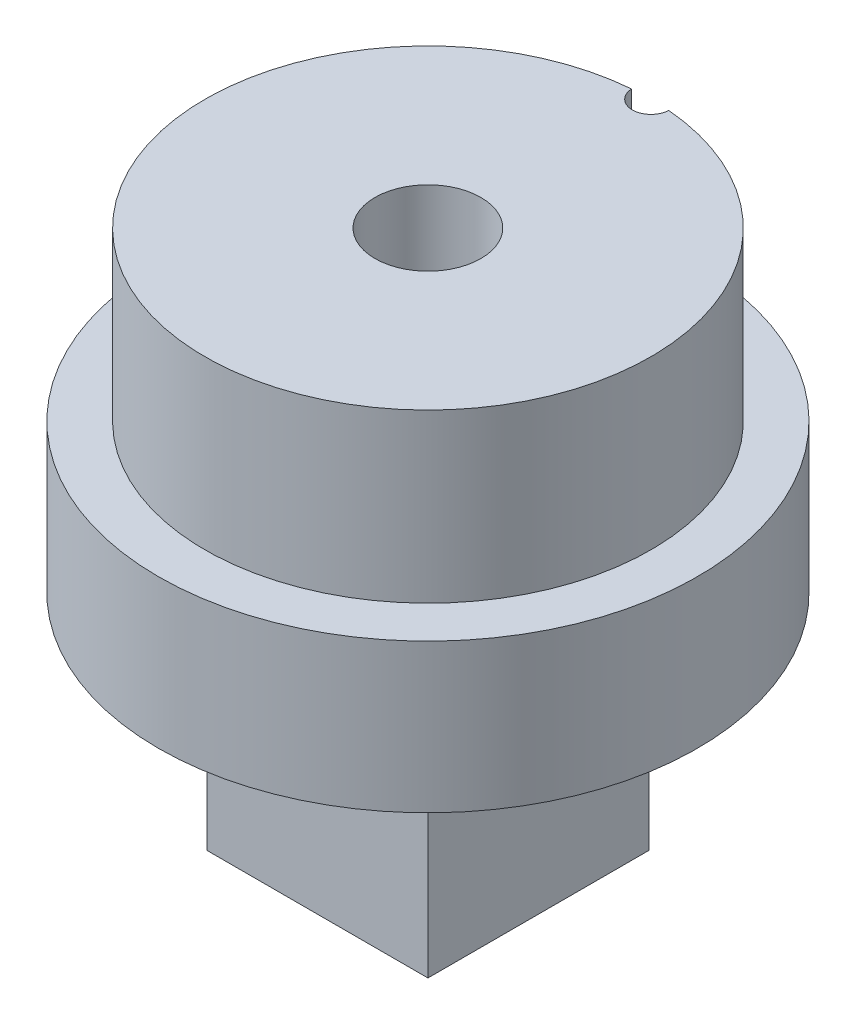
ISO-10303-21;
HEADER;
FILE_DESCRIPTION(('STEP AP214'),'2;1');
FILE_NAME('part.step','',(''),(''),'','','');
FILE_SCHEMA(('AUTOMOTIVE_DESIGN { 1 0 10303 214 1 1 1 1 }'));
ENDSEC;
DATA;
#1=APPLICATION_CONTEXT('core data for automotive mechanical design processes');
#2=APPLICATION_PROTOCOL_DEFINITION('international standard','automotive_design',2000,#1);
#3=PRODUCT_CONTEXT('',#1,'mechanical');
#4=PRODUCT('Part','Part','',(#3));
#5=PRODUCT_RELATED_PRODUCT_CATEGORY('part','',(#4));
#6=PRODUCT_DEFINITION_FORMATION('','',#4);
#7=PRODUCT_DEFINITION_CONTEXT('part definition',#1,'design');
#8=PRODUCT_DEFINITION('design','',#6,#7);
#9=PRODUCT_DEFINITION_SHAPE('','',#8);
#10=(LENGTH_UNIT() NAMED_UNIT(*) SI_UNIT(.MILLI.,.METRE.));
#11=(NAMED_UNIT(*) PLANE_ANGLE_UNIT() SI_UNIT($,.RADIAN.));
#12=(NAMED_UNIT(*) SI_UNIT($,.STERADIAN.) SOLID_ANGLE_UNIT());
#13=UNCERTAINTY_MEASURE_WITH_UNIT(LENGTH_MEASURE(1.E-05),#10,'distance_accuracy_value','');
#14=(GEOMETRIC_REPRESENTATION_CONTEXT(3) GLOBAL_UNCERTAINTY_ASSIGNED_CONTEXT((#13)) GLOBAL_UNIT_ASSIGNED_CONTEXT((#10,
#11,#12)) REPRESENTATION_CONTEXT('',''));
#15=CARTESIAN_POINT('',(0.,0.,0.));
#16=DIRECTION('',(0.,0.,1.));
#17=DIRECTION('',(1.,0.,0.));
#18=AXIS2_PLACEMENT_3D('',#15,#16,#17);
#19=CARTESIAN_POINT('',(0.,10.,0.));
#20=DIRECTION('',(0.,1.,0.));
#21=DIRECTION('',(0.,0.,1.));
#22=AXIS2_PLACEMENT_3D('',#19,#20,#21);
#23=PLANE('',#22);
#24=CARTESIAN_POINT('',(0.,10.,0.));
#25=DIRECTION('',(0.,1.,0.));
#26=DIRECTION('',(0.,0.,1.));
#27=AXIS2_PLACEMENT_3D('',#24,#25,#26);
#28=CIRCLE('',#27,7.25);
#29=CARTESIAN_POINT('',(0.,10.,7.25));
#30=VERTEX_POINT('',#29);
#31=EDGE_CURVE('E146',#30,#30,#28,.T.);
#32=ORIENTED_EDGE('',*,*,#31,.T.);
#33=EDGE_LOOP('',(#32));
#34=FACE_BOUND('',#33,.T.);
#35=CARTESIAN_POINT('',(0.,10.,0.));
#36=DIRECTION('',(0.,1.,0.));
#37=DIRECTION('',(0.,0.,1.));
#38=AXIS2_PLACEMENT_3D('',#35,#36,#37);
#39=CIRCLE('',#38,6.);
#40=CARTESIAN_POINT('',(-0.499565783678417,10.,-5.97916666666667));
#41=VERTEX_POINT('',#40);
#42=CARTESIAN_POINT('',(0.499565783678417,10.,-5.97916666666667));
#43=VERTEX_POINT('',#42);
#44=EDGE_CURVE('E60',#41,#43,#39,.T.);
#45=ORIENTED_EDGE('',*,*,#44,.F.);
#46=CARTESIAN_POINT('',(0.,10.,-6.));
#47=DIRECTION('',(0.,1.,0.));
#48=DIRECTION('',(0.,0.,1.));
#49=AXIS2_PLACEMENT_3D('',#46,#47,#48);
#50=CIRCLE('',#49,0.5);
#51=EDGE_CURVE('E115',#41,#43,#50,.T.);
#52=ORIENTED_EDGE('',*,*,#51,.T.);
#53=EDGE_LOOP('',(#45,#52));
#54=FACE_BOUND('',#53,.T.);
#55=ADVANCED_FACE('F45',(#34,#54),#23,.T.);
#56=CARTESIAN_POINT('',(2.975,6.,2.975));
#57=DIRECTION('',(-1.,0.,0.));
#58=DIRECTION('',(0.,0.,1.));
#59=AXIS2_PLACEMENT_3D('',#56,#57,#58);
#60=PLANE('',#59);
#61=DIRECTION('',(0.,0.,-1.));
#62=VECTOR('',#61,1.);
#63=CARTESIAN_POINT('',(2.975,0.,2.975));
#64=LINE('',#63,#62);
#65=CARTESIAN_POINT('',(2.975,0.,2.975));
#66=VERTEX_POINT('',#65);
#67=CARTESIAN_POINT('',(2.975,0.,-2.975));
#68=VERTEX_POINT('',#67);
#69=EDGE_CURVE('E150',#66,#68,#64,.T.);
#70=ORIENTED_EDGE('',*,*,#69,.T.);
#71=DIRECTION('',(0.,-1.,0.));
#72=VECTOR('',#71,1.);
#73=CARTESIAN_POINT('',(2.975,6.,-2.975));
#74=LINE('',#73,#72);
#75=CARTESIAN_POINT('',(2.975,6.,-2.975));
#76=VERTEX_POINT('',#75);
#77=EDGE_CURVE('E11',#76,#68,#74,.T.);
#78=ORIENTED_EDGE('',*,*,#77,.F.);
#79=DIRECTION('',(0.,0.,-1.));
#80=VECTOR('',#79,1.);
#81=CARTESIAN_POINT('',(2.975,6.,2.975));
#82=LINE('',#81,#80);
#83=CARTESIAN_POINT('',(2.975,6.,2.975));
#84=VERTEX_POINT('',#83);
#85=EDGE_CURVE('E154',#84,#76,#82,.T.);
#86=ORIENTED_EDGE('',*,*,#85,.F.);
#87=DIRECTION('',(0.,-1.,0.));
#88=VECTOR('',#87,1.);
#89=CARTESIAN_POINT('',(2.975,6.,2.975));
#90=LINE('',#89,#88);
#91=EDGE_CURVE('E168',#84,#66,#90,.T.);
#92=ORIENTED_EDGE('',*,*,#91,.T.);
#93=EDGE_LOOP('',(#70,#78,#86,#92));
#94=FACE_BOUND('',#93,.T.);
#95=ADVANCED_FACE('F47',(#94),#60,.F.);
#96=CARTESIAN_POINT('',(-2.975,6.,-2.975));
#97=DIRECTION('',(0.,0.,1.));
#98=DIRECTION('',(1.,0.,0.));
#99=AXIS2_PLACEMENT_3D('',#96,#97,#98);
#100=PLANE('',#99);
#101=DIRECTION('',(-1.,0.,0.));
#102=VECTOR('',#101,1.);
#103=CARTESIAN_POINT('',(-2.975,0.,-2.975));
#104=LINE('',#103,#102);
#105=CARTESIAN_POINT('',(-2.975,0.,-2.975));
#106=VERTEX_POINT('',#105);
#107=EDGE_CURVE('E172',#68,#106,#104,.T.);
#108=ORIENTED_EDGE('',*,*,#107,.T.);
#109=DIRECTION('',(0.,-1.,0.));
#110=VECTOR('',#109,1.);
#111=CARTESIAN_POINT('',(-2.975,6.,-2.975));
#112=LINE('',#111,#110);
#113=CARTESIAN_POINT('',(-2.975,6.,-2.975));
#114=VERTEX_POINT('',#113);
#115=EDGE_CURVE('E54',#114,#106,#112,.T.);
#116=ORIENTED_EDGE('',*,*,#115,.F.);
#117=DIRECTION('',(-1.,0.,0.));
#118=VECTOR('',#117,1.);
#119=CARTESIAN_POINT('',(-2.975,6.,-2.975));
#120=LINE('',#119,#118);
#121=EDGE_CURVE('E94',#76,#114,#120,.T.);
#122=ORIENTED_EDGE('',*,*,#121,.F.);
#123=ORIENTED_EDGE('',*,*,#77,.T.);
#124=EDGE_LOOP('',(#108,#116,#122,#123));
#125=FACE_BOUND('',#124,.T.);
#126=ADVANCED_FACE('F214',(#125),#100,.F.);
#127=CARTESIAN_POINT('',(-2.975,6.,2.975));
#128=DIRECTION('',(1.,0.,0.));
#129=DIRECTION('',(0.,0.,-1.));
#130=AXIS2_PLACEMENT_3D('',#127,#128,#129);
#131=PLANE('',#130);
#132=DIRECTION('',(0.,0.,1.));
#133=VECTOR('',#132,1.);
#134=CARTESIAN_POINT('',(-2.975,0.,2.975));
#135=LINE('',#134,#133);
#136=CARTESIAN_POINT('',(-2.975,0.,2.975));
#137=VERTEX_POINT('',#136);
#138=EDGE_CURVE('E175',#106,#137,#135,.T.);
#139=ORIENTED_EDGE('',*,*,#138,.T.);
#140=DIRECTION('',(0.,-1.,0.));
#141=VECTOR('',#140,1.);
#142=CARTESIAN_POINT('',(-2.975,6.,2.975));
#143=LINE('',#142,#141);
#144=CARTESIAN_POINT('',(-2.975,6.,2.975));
#145=VERTEX_POINT('',#144);
#146=EDGE_CURVE('E69',#145,#137,#143,.T.);
#147=ORIENTED_EDGE('',*,*,#146,.F.);
#148=DIRECTION('',(0.,0.,1.));
#149=VECTOR('',#148,1.);
#150=CARTESIAN_POINT('',(-2.975,6.,2.975));
#151=LINE('',#150,#149);
#152=EDGE_CURVE('E160',#114,#145,#151,.T.);
#153=ORIENTED_EDGE('',*,*,#152,.F.);
#154=ORIENTED_EDGE('',*,*,#115,.T.);
#155=EDGE_LOOP('',(#139,#147,#153,#154));
#156=FACE_BOUND('',#155,.T.);
#157=ADVANCED_FACE('F186',(#156),#131,.F.);
#158=CARTESIAN_POINT('',(-2.975,6.,2.975));
#159=DIRECTION('',(0.,0.,-1.));
#160=DIRECTION('',(-1.,0.,0.));
#161=AXIS2_PLACEMENT_3D('',#158,#159,#160);
#162=PLANE('',#161);
#163=DIRECTION('',(1.,0.,0.));
#164=VECTOR('',#163,1.);
#165=CARTESIAN_POINT('',(-2.975,0.,2.975));
#166=LINE('',#165,#164);
#167=EDGE_CURVE('E89',#137,#66,#166,.T.);
#168=ORIENTED_EDGE('',*,*,#167,.T.);
#169=ORIENTED_EDGE('',*,*,#91,.F.);
#170=DIRECTION('',(1.,0.,0.));
#171=VECTOR('',#170,1.);
#172=CARTESIAN_POINT('',(-2.975,6.,2.975));
#173=LINE('',#172,#171);
#174=EDGE_CURVE('E164',#145,#84,#173,.T.);
#175=ORIENTED_EDGE('',*,*,#174,.F.);
#176=ORIENTED_EDGE('',*,*,#146,.T.);
#177=EDGE_LOOP('',(#168,#169,#175,#176));
#178=FACE_BOUND('',#177,.T.);
#179=ADVANCED_FACE('F191',(#178),#162,.F.);
#180=CARTESIAN_POINT('',(0.,0.,0.));
#181=DIRECTION('',(0.,-1.,0.));
#182=DIRECTION('',(0.,0.,-1.));
#183=AXIS2_PLACEMENT_3D('',#180,#181,#182);
#184=PLANE('',#183);
#185=CARTESIAN_POINT('',(0.,0.,0.));
#186=DIRECTION('',(0.,-1.,0.));
#187=DIRECTION('',(0.,0.,-1.));
#188=AXIS2_PLACEMENT_3D('',#185,#186,#187);
#189=CIRCLE('',#188,1.425);
#190=CARTESIAN_POINT('',(0.,0.,-1.425));
#191=VERTEX_POINT('',#190);
#192=EDGE_CURVE('E118',#191,#191,#189,.T.);
#193=ORIENTED_EDGE('',*,*,#192,.F.);
#194=EDGE_LOOP('',(#193));
#195=FACE_BOUND('',#194,.T.);
#196=ORIENTED_EDGE('',*,*,#69,.F.);
#197=ORIENTED_EDGE('',*,*,#167,.F.);
#198=ORIENTED_EDGE('',*,*,#138,.F.);
#199=ORIENTED_EDGE('',*,*,#107,.F.);
#200=EDGE_LOOP('',(#196,#197,#198,#199));
#201=FACE_BOUND('',#200,.T.);
#202=ADVANCED_FACE('F189',(#195,#201),#184,.T.);
#203=CARTESIAN_POINT('',(0.,6.,0.));
#204=DIRECTION('',(0.,1.,0.));
#205=DIRECTION('',(0.,0.,1.));
#206=AXIS2_PLACEMENT_3D('',#203,#204,#205);
#207=PLANE('',#206);
#208=CARTESIAN_POINT('',(0.,6.,0.));
#209=DIRECTION('',(0.,1.,0.));
#210=DIRECTION('',(0.,0.,1.));
#211=AXIS2_PLACEMENT_3D('',#208,#209,#210);
#212=CIRCLE('',#211,7.25);
#213=CARTESIAN_POINT('',(0.,6.,7.25));
#214=VERTEX_POINT('',#213);
#215=EDGE_CURVE('E145',#214,#214,#212,.T.);
#216=ORIENTED_EDGE('',*,*,#215,.F.);
#217=EDGE_LOOP('',(#216));
#218=FACE_BOUND('',#217,.T.);
#219=ORIENTED_EDGE('',*,*,#174,.T.);
#220=ORIENTED_EDGE('',*,*,#85,.T.);
#221=ORIENTED_EDGE('',*,*,#121,.T.);
#222=ORIENTED_EDGE('',*,*,#152,.T.);
#223=EDGE_LOOP('',(#219,#220,#221,#222));
#224=FACE_BOUND('',#223,.T.);
#225=ADVANCED_FACE('F193',(#218,#224),#207,.F.);
#226=CARTESIAN_POINT('',(0.,10.,0.));
#227=DIRECTION('',(0.,-1.,0.));
#228=DIRECTION('',(0.,0.,-1.));
#229=AXIS2_PLACEMENT_3D('',#226,#227,#228);
#230=CYLINDRICAL_SURFACE('',#229,7.25);
#231=ORIENTED_EDGE('',*,*,#31,.F.);
#232=EDGE_LOOP('',(#231));
#233=FACE_BOUND('',#232,.T.);
#234=ORIENTED_EDGE('',*,*,#215,.T.);
#235=EDGE_LOOP('',(#234));
#236=FACE_BOUND('',#235,.T.);
#237=ADVANCED_FACE('F195',(#233,#236),#230,.T.);
#238=CARTESIAN_POINT('',(0.,10.,0.));
#239=DIRECTION('',(0.,-1.,0.));
#240=DIRECTION('',(0.,0.,-1.));
#241=AXIS2_PLACEMENT_3D('',#238,#239,#240);
#242=CYLINDRICAL_SURFACE('',#241,1.425);
#243=ORIENTED_EDGE('',*,*,#192,.T.);
#244=EDGE_LOOP('',(#243));
#245=FACE_BOUND('',#244,.T.);
#246=CARTESIAN_POINT('',(0.,14.5,0.));
#247=DIRECTION('',(0.,1.,0.));
#248=DIRECTION('',(0.,0.,1.));
#249=AXIS2_PLACEMENT_3D('',#246,#247,#248);
#250=CIRCLE('',#249,1.425);
#251=CARTESIAN_POINT('',(0.,14.5,1.425));
#252=VERTEX_POINT('',#251);
#253=EDGE_CURVE('E126',#252,#252,#250,.F.);
#254=ORIENTED_EDGE('',*,*,#253,.F.);
#255=EDGE_LOOP('',(#254));
#256=FACE_BOUND('',#255,.T.);
#257=ADVANCED_FACE('F202',(#245,#256),#242,.F.);
#258=CARTESIAN_POINT('',(0.,14.5,-6.));
#259=DIRECTION('',(0.,-1.,0.));
#260=DIRECTION('',(0.,0.,-1.));
#261=AXIS2_PLACEMENT_3D('',#258,#259,#260);
#262=CYLINDRICAL_SURFACE('',#261,0.5);
#263=ORIENTED_EDGE('',*,*,#51,.F.);
#264=DIRECTION('',(0.,-1.,0.));
#265=VECTOR('',#264,1.);
#266=CARTESIAN_POINT('',(-0.499565783678417,14.5,-5.97916666666667));
#267=LINE('',#266,#265);
#268=CARTESIAN_POINT('',(-0.499565783678417,14.5,-5.97916666666667));
#269=VERTEX_POINT('',#268);
#270=EDGE_CURVE('E109',#269,#41,#267,.T.);
#271=ORIENTED_EDGE('',*,*,#270,.F.);
#272=CARTESIAN_POINT('',(0.,14.5,-6.));
#273=DIRECTION('',(0.,1.,0.));
#274=DIRECTION('',(0.,0.,1.));
#275=AXIS2_PLACEMENT_3D('',#272,#273,#274);
#276=CIRCLE('',#275,0.5);
#277=CARTESIAN_POINT('',(0.499565783678417,14.5,-5.97916666666667));
#278=VERTEX_POINT('',#277);
#279=EDGE_CURVE('E114',#269,#278,#276,.T.);
#280=ORIENTED_EDGE('',*,*,#279,.T.);
#281=DIRECTION('',(0.,-1.,0.));
#282=VECTOR('',#281,1.);
#283=CARTESIAN_POINT('',(0.499565783678417,14.5,-5.97916666666667));
#284=LINE('',#283,#282);
#285=EDGE_CURVE('E119',#278,#43,#284,.T.);
#286=ORIENTED_EDGE('',*,*,#285,.T.);
#287=EDGE_LOOP('',(#263,#271,#280,#286));
#288=FACE_BOUND('',#287,.T.);
#289=ADVANCED_FACE('F111',(#288),#262,.F.);
#290=CARTESIAN_POINT('',(0.,14.5,0.));
#291=DIRECTION('',(0.,-1.,0.));
#292=DIRECTION('',(0.,0.,-1.));
#293=AXIS2_PLACEMENT_3D('',#290,#291,#292);
#294=CYLINDRICAL_SURFACE('',#293,6.);
#295=ORIENTED_EDGE('',*,*,#44,.T.);
#296=ORIENTED_EDGE('',*,*,#285,.F.);
#297=CARTESIAN_POINT('',(0.,14.5,0.));
#298=DIRECTION('',(0.,1.,0.));
#299=DIRECTION('',(0.,0.,1.));
#300=AXIS2_PLACEMENT_3D('',#297,#298,#299);
#301=CIRCLE('',#300,6.);
#302=EDGE_CURVE('E122',#269,#278,#301,.T.);
#303=ORIENTED_EDGE('',*,*,#302,.F.);
#304=ORIENTED_EDGE('',*,*,#270,.T.);
#305=EDGE_LOOP('',(#295,#296,#303,#304));
#306=FACE_BOUND('',#305,.T.);
#307=ADVANCED_FACE('F123',(#306),#294,.T.);
#308=CARTESIAN_POINT('',(0.,14.5,0.));
#309=DIRECTION('',(0.,1.,0.));
#310=DIRECTION('',(0.,0.,1.));
#311=AXIS2_PLACEMENT_3D('',#308,#309,#310);
#312=PLANE('',#311);
#313=ORIENTED_EDGE('',*,*,#279,.F.);
#314=ORIENTED_EDGE('',*,*,#302,.T.);
#315=EDGE_LOOP('',(#313,#314));
#316=FACE_BOUND('',#315,.T.);
#317=ORIENTED_EDGE('',*,*,#253,.T.);
#318=EDGE_LOOP('',(#317));
#319=FACE_BOUND('',#318,.T.);
#320=ADVANCED_FACE('F128',(#316,#319),#312,.T.);
#321=CLOSED_SHELL('',(#55,#95,#126,#157,#179,#202,#225,#237,#257,#289,#307,#320));
#322=MANIFOLD_SOLID_BREP('B2',#321);
#323=ADVANCED_BREP_SHAPE_REPRESENTATION('',(#18,#322),#14);
#324=SHAPE_DEFINITION_REPRESENTATION(#9,#323);
ENDSEC;
END-ISO-10303-21;
